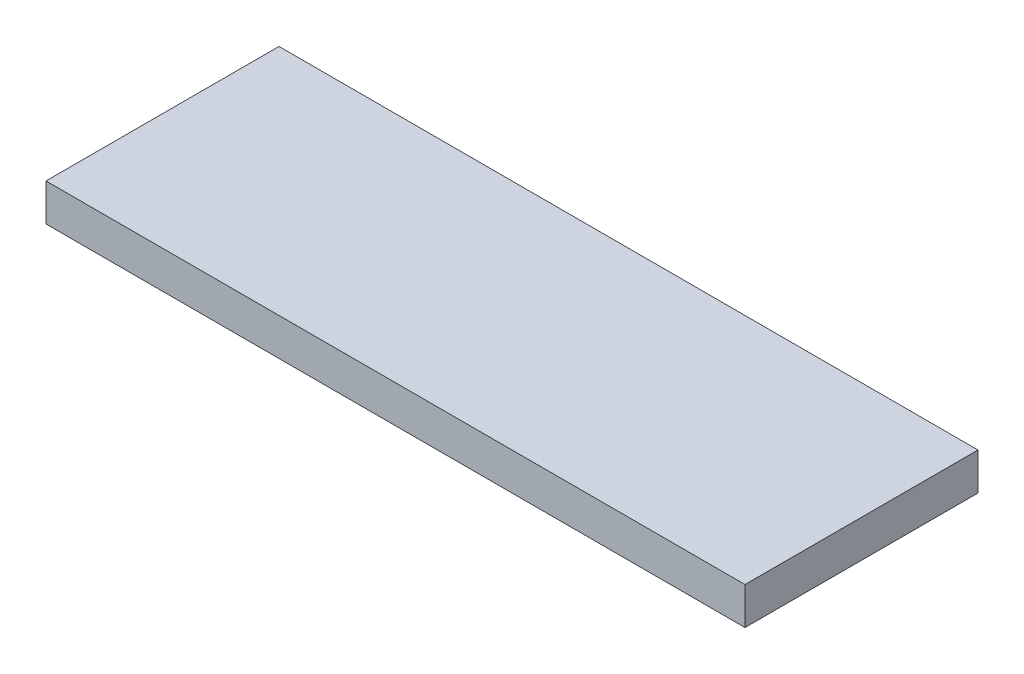
ISO-10303-21;
HEADER;
FILE_DESCRIPTION(('STEP AP214'),'2;1');
FILE_NAME('part.step','',(''),(''),'','','');
FILE_SCHEMA(('AUTOMOTIVE_DESIGN { 1 0 10303 214 1 1 1 1 }'));
ENDSEC;
DATA;
#1=APPLICATION_CONTEXT('core data for automotive mechanical design processes');
#2=APPLICATION_PROTOCOL_DEFINITION('international standard','automotive_design',2000,#1);
#3=PRODUCT_CONTEXT('',#1,'mechanical');
#4=PRODUCT('Part','Part','',(#3));
#5=PRODUCT_RELATED_PRODUCT_CATEGORY('part','',(#4));
#6=PRODUCT_DEFINITION_FORMATION('','',#4);
#7=PRODUCT_DEFINITION_CONTEXT('part definition',#1,'design');
#8=PRODUCT_DEFINITION('design','',#6,#7);
#9=PRODUCT_DEFINITION_SHAPE('','',#8);
#10=(LENGTH_UNIT() NAMED_UNIT(*) SI_UNIT(.MILLI.,.METRE.));
#11=(NAMED_UNIT(*) PLANE_ANGLE_UNIT() SI_UNIT($,.RADIAN.));
#12=(NAMED_UNIT(*) SI_UNIT($,.STERADIAN.) SOLID_ANGLE_UNIT());
#13=UNCERTAINTY_MEASURE_WITH_UNIT(LENGTH_MEASURE(1.E-05),#10,'distance_accuracy_value','');
#14=(GEOMETRIC_REPRESENTATION_CONTEXT(3) GLOBAL_UNCERTAINTY_ASSIGNED_CONTEXT((#13)) GLOBAL_UNIT_ASSIGNED_CONTEXT((#10,
#11,#12)) REPRESENTATION_CONTEXT('',''));
#15=CARTESIAN_POINT('',(0.,0.,0.));
#16=DIRECTION('',(0.,0.,1.));
#17=DIRECTION('',(1.,0.,0.));
#18=AXIS2_PLACEMENT_3D('',#15,#16,#17);
#19=CARTESIAN_POINT('',(750.,80.,-250.));
#20=DIRECTION('',(-1.,0.,0.));
#21=DIRECTION('',(0.,0.,1.));
#22=AXIS2_PLACEMENT_3D('',#19,#20,#21);
#23=PLANE('',#22);
#24=DIRECTION('',(0.,0.,-1.));
#25=VECTOR('',#24,1.);
#26=CARTESIAN_POINT('',(750.,0.,-250.));
#27=LINE('',#26,#25);
#28=CARTESIAN_POINT('',(750.,0.,250.));
#29=VERTEX_POINT('',#28);
#30=CARTESIAN_POINT('',(750.,0.,-250.));
#31=VERTEX_POINT('',#30);
#32=EDGE_CURVE('E100',#29,#31,#27,.T.);
#33=ORIENTED_EDGE('',*,*,#32,.T.);
#34=DIRECTION('',(0.,-1.,0.));
#35=VECTOR('',#34,1.);
#36=CARTESIAN_POINT('',(750.,80.,-250.));
#37=LINE('',#36,#35);
#38=CARTESIAN_POINT('',(750.,80.,-250.));
#39=VERTEX_POINT('',#38);
#40=EDGE_CURVE('E11',#39,#31,#37,.T.);
#41=ORIENTED_EDGE('',*,*,#40,.F.);
#42=DIRECTION('',(0.,0.,-1.));
#43=VECTOR('',#42,1.);
#44=CARTESIAN_POINT('',(750.,80.,-250.));
#45=LINE('',#44,#43);
#46=CARTESIAN_POINT('',(750.,80.,250.));
#47=VERTEX_POINT('',#46);
#48=EDGE_CURVE('E88',#47,#39,#45,.T.);
#49=ORIENTED_EDGE('',*,*,#48,.F.);
#50=DIRECTION('',(0.,-1.,0.));
#51=VECTOR('',#50,1.);
#52=CARTESIAN_POINT('',(750.,80.,250.));
#53=LINE('',#52,#51);
#54=EDGE_CURVE('E96',#47,#29,#53,.T.);
#55=ORIENTED_EDGE('',*,*,#54,.T.);
#56=EDGE_LOOP('',(#33,#41,#49,#55));
#57=FACE_BOUND('',#56,.T.);
#58=ADVANCED_FACE('F37',(#57),#23,.F.);
#59=CARTESIAN_POINT('',(-750.,80.,-250.));
#60=DIRECTION('',(0.,0.,1.));
#61=DIRECTION('',(1.,0.,0.));
#62=AXIS2_PLACEMENT_3D('',#59,#60,#61);
#63=PLANE('',#62);
#64=DIRECTION('',(-1.,0.,0.));
#65=VECTOR('',#64,1.);
#66=CARTESIAN_POINT('',(-750.,0.,-250.));
#67=LINE('',#66,#65);
#68=CARTESIAN_POINT('',(-750.,0.,-250.));
#69=VERTEX_POINT('',#68);
#70=EDGE_CURVE('E92',#31,#69,#67,.T.);
#71=ORIENTED_EDGE('',*,*,#70,.T.);
#72=DIRECTION('',(0.,-1.,0.));
#73=VECTOR('',#72,1.);
#74=CARTESIAN_POINT('',(-750.,80.,-250.));
#75=LINE('',#74,#73);
#76=CARTESIAN_POINT('',(-750.,80.,-250.));
#77=VERTEX_POINT('',#76);
#78=EDGE_CURVE('E45',#77,#69,#75,.T.);
#79=ORIENTED_EDGE('',*,*,#78,.F.);
#80=DIRECTION('',(-1.,0.,0.));
#81=VECTOR('',#80,1.);
#82=CARTESIAN_POINT('',(-750.,80.,-250.));
#83=LINE('',#82,#81);
#84=EDGE_CURVE('E83',#39,#77,#83,.T.);
#85=ORIENTED_EDGE('',*,*,#84,.F.);
#86=ORIENTED_EDGE('',*,*,#40,.T.);
#87=EDGE_LOOP('',(#71,#79,#85,#86));
#88=FACE_BOUND('',#87,.T.);
#89=ADVANCED_FACE('F91',(#88),#63,.F.);
#90=CARTESIAN_POINT('',(-750.,80.,-250.));
#91=DIRECTION('',(1.,0.,0.));
#92=DIRECTION('',(0.,0.,-1.));
#93=AXIS2_PLACEMENT_3D('',#90,#91,#92);
#94=PLANE('',#93);
#95=DIRECTION('',(0.,0.,1.));
#96=VECTOR('',#95,1.);
#97=CARTESIAN_POINT('',(-750.,0.,-250.));
#98=LINE('',#97,#96);
#99=CARTESIAN_POINT('',(-750.,0.,250.));
#100=VERTEX_POINT('',#99);
#101=EDGE_CURVE('E70',#69,#100,#98,.T.);
#102=ORIENTED_EDGE('',*,*,#101,.T.);
#103=DIRECTION('',(0.,-1.,0.));
#104=VECTOR('',#103,1.);
#105=CARTESIAN_POINT('',(-750.,80.,250.));
#106=LINE('',#105,#104);
#107=CARTESIAN_POINT('',(-750.,80.,250.));
#108=VERTEX_POINT('',#107);
#109=EDGE_CURVE('E93',#108,#100,#106,.T.);
#110=ORIENTED_EDGE('',*,*,#109,.F.);
#111=DIRECTION('',(0.,0.,1.));
#112=VECTOR('',#111,1.);
#113=CARTESIAN_POINT('',(-750.,80.,-250.));
#114=LINE('',#113,#112);
#115=EDGE_CURVE('E86',#77,#108,#114,.T.);
#116=ORIENTED_EDGE('',*,*,#115,.F.);
#117=ORIENTED_EDGE('',*,*,#78,.T.);
#118=EDGE_LOOP('',(#102,#110,#116,#117));
#119=FACE_BOUND('',#118,.T.);
#120=ADVANCED_FACE('F94',(#119),#94,.F.);
#121=CARTESIAN_POINT('',(-750.,80.,250.));
#122=DIRECTION('',(0.,0.,-1.));
#123=DIRECTION('',(-1.,0.,0.));
#124=AXIS2_PLACEMENT_3D('',#121,#122,#123);
#125=PLANE('',#124);
#126=DIRECTION('',(1.,0.,0.));
#127=VECTOR('',#126,1.);
#128=CARTESIAN_POINT('',(-750.,0.,250.));
#129=LINE('',#128,#127);
#130=EDGE_CURVE('E76',#100,#29,#129,.T.);
#131=ORIENTED_EDGE('',*,*,#130,.T.);
#132=ORIENTED_EDGE('',*,*,#54,.F.);
#133=DIRECTION('',(1.,0.,0.));
#134=VECTOR('',#133,1.);
#135=CARTESIAN_POINT('',(-750.,80.,250.));
#136=LINE('',#135,#134);
#137=EDGE_CURVE('E53',#108,#47,#136,.T.);
#138=ORIENTED_EDGE('',*,*,#137,.F.);
#139=ORIENTED_EDGE('',*,*,#109,.T.);
#140=EDGE_LOOP('',(#131,#132,#138,#139));
#141=FACE_BOUND('',#140,.T.);
#142=ADVANCED_FACE('F107',(#141),#125,.F.);
#143=CARTESIAN_POINT('',(0.,80.,0.));
#144=DIRECTION('',(0.,1.,0.));
#145=DIRECTION('',(0.,0.,1.));
#146=AXIS2_PLACEMENT_3D('',#143,#144,#145);
#147=PLANE('',#146);
#148=ORIENTED_EDGE('',*,*,#48,.T.);
#149=ORIENTED_EDGE('',*,*,#84,.T.);
#150=ORIENTED_EDGE('',*,*,#115,.T.);
#151=ORIENTED_EDGE('',*,*,#137,.T.);
#152=EDGE_LOOP('',(#148,#149,#150,#151));
#153=FACE_BOUND('',#152,.T.);
#154=ADVANCED_FACE('F84',(#153),#147,.T.);
#155=CARTESIAN_POINT('',(0.,0.,0.));
#156=DIRECTION('',(0.,1.,0.));
#157=DIRECTION('',(0.,0.,1.));
#158=AXIS2_PLACEMENT_3D('',#155,#156,#157);
#159=PLANE('',#158);
#160=ORIENTED_EDGE('',*,*,#32,.F.);
#161=ORIENTED_EDGE('',*,*,#130,.F.);
#162=ORIENTED_EDGE('',*,*,#101,.F.);
#163=ORIENTED_EDGE('',*,*,#70,.F.);
#164=EDGE_LOOP('',(#160,#161,#162,#163));
#165=FACE_BOUND('',#164,.T.);
#166=ADVANCED_FACE('F110',(#165),#159,.F.);
#167=CLOSED_SHELL('',(#58,#89,#120,#142,#154,#166));
#168=MANIFOLD_SOLID_BREP('B2',#167);
#169=ADVANCED_BREP_SHAPE_REPRESENTATION('',(#18,#168),#14);
#170=SHAPE_DEFINITION_REPRESENTATION(#9,#169);
ENDSEC;
END-ISO-10303-21;
